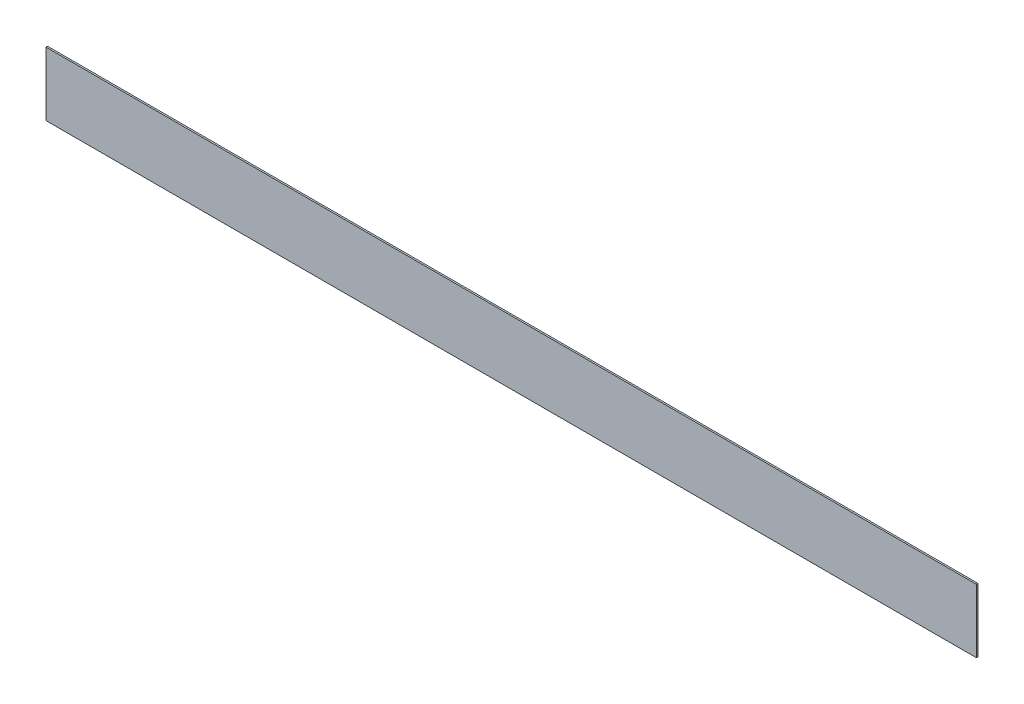
ISO-10303-21;
HEADER;
FILE_DESCRIPTION(('STEP AP214'),'2;1');
FILE_NAME('part.step','',(''),(''),'','','');
FILE_SCHEMA(('AUTOMOTIVE_DESIGN { 1 0 10303 214 1 1 1 1 }'));
ENDSEC;
DATA;
#1=APPLICATION_CONTEXT('core data for automotive mechanical design processes');
#2=APPLICATION_PROTOCOL_DEFINITION('international standard','automotive_design',2000,#1);
#3=PRODUCT_CONTEXT('',#1,'mechanical');
#4=PRODUCT('Part','Part','',(#3));
#5=PRODUCT_RELATED_PRODUCT_CATEGORY('part','',(#4));
#6=PRODUCT_DEFINITION_FORMATION('','',#4);
#7=PRODUCT_DEFINITION_CONTEXT('part definition',#1,'design');
#8=PRODUCT_DEFINITION('design','',#6,#7);
#9=PRODUCT_DEFINITION_SHAPE('','',#8);
#10=(LENGTH_UNIT() NAMED_UNIT(*) SI_UNIT(.MILLI.,.METRE.));
#11=(NAMED_UNIT(*) PLANE_ANGLE_UNIT() SI_UNIT($,.RADIAN.));
#12=(NAMED_UNIT(*) SI_UNIT($,.STERADIAN.) SOLID_ANGLE_UNIT());
#13=UNCERTAINTY_MEASURE_WITH_UNIT(LENGTH_MEASURE(1.E-05),#10,'distance_accuracy_value','');
#14=(GEOMETRIC_REPRESENTATION_CONTEXT(3) GLOBAL_UNCERTAINTY_ASSIGNED_CONTEXT((#13)) GLOBAL_UNIT_ASSIGNED_CONTEXT((#10,
#11,#12)) REPRESENTATION_CONTEXT('',''));
#15=CARTESIAN_POINT('',(0.,0.,0.));
#16=DIRECTION('',(0.,0.,1.));
#17=DIRECTION('',(1.,0.,0.));
#18=AXIS2_PLACEMENT_3D('',#15,#16,#17);
#19=CARTESIAN_POINT('',(0.,0.,2.));
#20=DIRECTION('',(1.,0.,0.));
#21=DIRECTION('',(0.,0.,-1.));
#22=AXIS2_PLACEMENT_3D('',#19,#20,#21);
#23=PLANE('',#22);
#24=DIRECTION('',(0.,-1.,0.));
#25=VECTOR('',#24,1.);
#26=CARTESIAN_POINT('',(0.,0.,0.));
#27=LINE('',#26,#25);
#28=CARTESIAN_POINT('',(0.,0.,0.));
#29=VERTEX_POINT('',#28);
#30=CARTESIAN_POINT('',(0.,-80.,0.));
#31=VERTEX_POINT('',#30);
#32=EDGE_CURVE('E100',#29,#31,#27,.T.);
#33=ORIENTED_EDGE('',*,*,#32,.T.);
#34=DIRECTION('',(0.,0.,-1.));
#35=VECTOR('',#34,1.);
#36=CARTESIAN_POINT('',(0.,-80.,2.));
#37=LINE('',#36,#35);
#38=CARTESIAN_POINT('',(0.,-80.,2.));
#39=VERTEX_POINT('',#38);
#40=EDGE_CURVE('E11',#39,#31,#37,.T.);
#41=ORIENTED_EDGE('',*,*,#40,.F.);
#42=DIRECTION('',(0.,-1.,0.));
#43=VECTOR('',#42,1.);
#44=CARTESIAN_POINT('',(0.,0.,2.));
#45=LINE('',#44,#43);
#46=CARTESIAN_POINT('',(0.,0.,2.));
#47=VERTEX_POINT('',#46);
#48=EDGE_CURVE('E88',#47,#39,#45,.T.);
#49=ORIENTED_EDGE('',*,*,#48,.F.);
#50=DIRECTION('',(0.,0.,-1.));
#51=VECTOR('',#50,1.);
#52=CARTESIAN_POINT('',(0.,0.,2.));
#53=LINE('',#52,#51);
#54=EDGE_CURVE('E96',#47,#29,#53,.T.);
#55=ORIENTED_EDGE('',*,*,#54,.T.);
#56=EDGE_LOOP('',(#33,#41,#49,#55));
#57=FACE_BOUND('',#56,.T.);
#58=ADVANCED_FACE('F37',(#57),#23,.F.);
#59=CARTESIAN_POINT('',(0.,-80.,2.));
#60=DIRECTION('',(0.,1.,0.));
#61=DIRECTION('',(0.,0.,1.));
#62=AXIS2_PLACEMENT_3D('',#59,#60,#61);
#63=PLANE('',#62);
#64=DIRECTION('',(1.,0.,0.));
#65=VECTOR('',#64,1.);
#66=CARTESIAN_POINT('',(0.,-80.,0.));
#67=LINE('',#66,#65);
#68=CARTESIAN_POINT('',(1170.,-80.,0.));
#69=VERTEX_POINT('',#68);
#70=EDGE_CURVE('E92',#31,#69,#67,.T.);
#71=ORIENTED_EDGE('',*,*,#70,.T.);
#72=DIRECTION('',(0.,0.,-1.));
#73=VECTOR('',#72,1.);
#74=CARTESIAN_POINT('',(1170.,-80.,2.));
#75=LINE('',#74,#73);
#76=CARTESIAN_POINT('',(1170.,-80.,2.));
#77=VERTEX_POINT('',#76);
#78=EDGE_CURVE('E45',#77,#69,#75,.T.);
#79=ORIENTED_EDGE('',*,*,#78,.F.);
#80=DIRECTION('',(1.,0.,0.));
#81=VECTOR('',#80,1.);
#82=CARTESIAN_POINT('',(0.,-80.,2.));
#83=LINE('',#82,#81);
#84=EDGE_CURVE('E83',#39,#77,#83,.T.);
#85=ORIENTED_EDGE('',*,*,#84,.F.);
#86=ORIENTED_EDGE('',*,*,#40,.T.);
#87=EDGE_LOOP('',(#71,#79,#85,#86));
#88=FACE_BOUND('',#87,.T.);
#89=ADVANCED_FACE('F91',(#88),#63,.F.);
#90=CARTESIAN_POINT('',(1170.,0.,2.));
#91=DIRECTION('',(-1.,0.,0.));
#92=DIRECTION('',(0.,0.,1.));
#93=AXIS2_PLACEMENT_3D('',#90,#91,#92);
#94=PLANE('',#93);
#95=DIRECTION('',(0.,1.,0.));
#96=VECTOR('',#95,1.);
#97=CARTESIAN_POINT('',(1170.,0.,0.));
#98=LINE('',#97,#96);
#99=CARTESIAN_POINT('',(1170.,0.,0.));
#100=VERTEX_POINT('',#99);
#101=EDGE_CURVE('E70',#69,#100,#98,.T.);
#102=ORIENTED_EDGE('',*,*,#101,.T.);
#103=DIRECTION('',(0.,0.,-1.));
#104=VECTOR('',#103,1.);
#105=CARTESIAN_POINT('',(1170.,0.,2.));
#106=LINE('',#105,#104);
#107=CARTESIAN_POINT('',(1170.,0.,2.));
#108=VERTEX_POINT('',#107);
#109=EDGE_CURVE('E93',#108,#100,#106,.T.);
#110=ORIENTED_EDGE('',*,*,#109,.F.);
#111=DIRECTION('',(0.,1.,0.));
#112=VECTOR('',#111,1.);
#113=CARTESIAN_POINT('',(1170.,0.,2.));
#114=LINE('',#113,#112);
#115=EDGE_CURVE('E86',#77,#108,#114,.T.);
#116=ORIENTED_EDGE('',*,*,#115,.F.);
#117=ORIENTED_EDGE('',*,*,#78,.T.);
#118=EDGE_LOOP('',(#102,#110,#116,#117));
#119=FACE_BOUND('',#118,.T.);
#120=ADVANCED_FACE('F94',(#119),#94,.F.);
#121=CARTESIAN_POINT('',(0.,0.,2.));
#122=DIRECTION('',(0.,-1.,0.));
#123=DIRECTION('',(0.,0.,-1.));
#124=AXIS2_PLACEMENT_3D('',#121,#122,#123);
#125=PLANE('',#124);
#126=DIRECTION('',(-1.,0.,0.));
#127=VECTOR('',#126,1.);
#128=CARTESIAN_POINT('',(0.,0.,0.));
#129=LINE('',#128,#127);
#130=EDGE_CURVE('E76',#100,#29,#129,.T.);
#131=ORIENTED_EDGE('',*,*,#130,.T.);
#132=ORIENTED_EDGE('',*,*,#54,.F.);
#133=DIRECTION('',(-1.,0.,0.));
#134=VECTOR('',#133,1.);
#135=CARTESIAN_POINT('',(0.,0.,2.));
#136=LINE('',#135,#134);
#137=EDGE_CURVE('E53',#108,#47,#136,.T.);
#138=ORIENTED_EDGE('',*,*,#137,.F.);
#139=ORIENTED_EDGE('',*,*,#109,.T.);
#140=EDGE_LOOP('',(#131,#132,#138,#139));
#141=FACE_BOUND('',#140,.T.);
#142=ADVANCED_FACE('F107',(#141),#125,.F.);
#143=CARTESIAN_POINT('',(0.,0.,2.));
#144=DIRECTION('',(0.,0.,1.));
#145=DIRECTION('',(1.,0.,0.));
#146=AXIS2_PLACEMENT_3D('',#143,#144,#145);
#147=PLANE('',#146);
#148=ORIENTED_EDGE('',*,*,#48,.T.);
#149=ORIENTED_EDGE('',*,*,#84,.T.);
#150=ORIENTED_EDGE('',*,*,#115,.T.);
#151=ORIENTED_EDGE('',*,*,#137,.T.);
#152=EDGE_LOOP('',(#148,#149,#150,#151));
#153=FACE_BOUND('',#152,.T.);
#154=ADVANCED_FACE('F84',(#153),#147,.T.);
#155=CARTESIAN_POINT('',(0.,0.,0.));
#156=DIRECTION('',(0.,0.,1.));
#157=DIRECTION('',(1.,0.,0.));
#158=AXIS2_PLACEMENT_3D('',#155,#156,#157);
#159=PLANE('',#158);
#160=ORIENTED_EDGE('',*,*,#32,.F.);
#161=ORIENTED_EDGE('',*,*,#130,.F.);
#162=ORIENTED_EDGE('',*,*,#101,.F.);
#163=ORIENTED_EDGE('',*,*,#70,.F.);
#164=EDGE_LOOP('',(#160,#161,#162,#163));
#165=FACE_BOUND('',#164,.T.);
#166=ADVANCED_FACE('F110',(#165),#159,.F.);
#167=CLOSED_SHELL('',(#58,#89,#120,#142,#154,#166));
#168=MANIFOLD_SOLID_BREP('B2',#167);
#169=ADVANCED_BREP_SHAPE_REPRESENTATION('',(#18,#168),#14);
#170=SHAPE_DEFINITION_REPRESENTATION(#9,#169);
ENDSEC;
END-ISO-10303-21;
